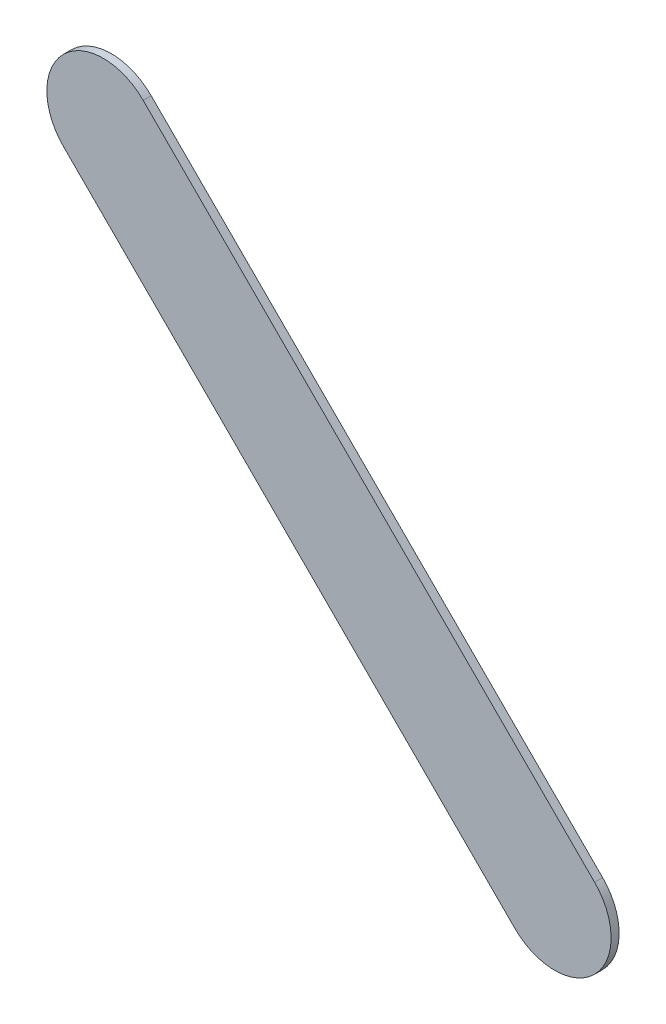
ISO-10303-21;
HEADER;
FILE_DESCRIPTION(('STEP AP214'),'2;1');
FILE_NAME('part.step','',(''),(''),'','','');
FILE_SCHEMA(('AUTOMOTIVE_DESIGN { 1 0 10303 214 1 1 1 1 }'));
ENDSEC;
DATA;
#1=APPLICATION_CONTEXT('core data for automotive mechanical design processes');
#2=APPLICATION_PROTOCOL_DEFINITION('international standard','automotive_design',2000,#1);
#3=PRODUCT_CONTEXT('',#1,'mechanical');
#4=PRODUCT('Part','Part','',(#3));
#5=PRODUCT_RELATED_PRODUCT_CATEGORY('part','',(#4));
#6=PRODUCT_DEFINITION_FORMATION('','',#4);
#7=PRODUCT_DEFINITION_CONTEXT('part definition',#1,'design');
#8=PRODUCT_DEFINITION('design','',#6,#7);
#9=PRODUCT_DEFINITION_SHAPE('','',#8);
#10=(LENGTH_UNIT() NAMED_UNIT(*) SI_UNIT(.MILLI.,.METRE.));
#11=(NAMED_UNIT(*) PLANE_ANGLE_UNIT() SI_UNIT($,.RADIAN.));
#12=(NAMED_UNIT(*) SI_UNIT($,.STERADIAN.) SOLID_ANGLE_UNIT());
#13=UNCERTAINTY_MEASURE_WITH_UNIT(LENGTH_MEASURE(1.E-05),#10,'distance_accuracy_value','');
#14=(GEOMETRIC_REPRESENTATION_CONTEXT(3) GLOBAL_UNCERTAINTY_ASSIGNED_CONTEXT((#13)) GLOBAL_UNIT_ASSIGNED_CONTEXT((#10,
#11,#12)) REPRESENTATION_CONTEXT('',''));
#15=CARTESIAN_POINT('',(0.,0.,0.));
#16=DIRECTION('',(0.,0.,1.));
#17=DIRECTION('',(1.,0.,0.));
#18=AXIS2_PLACEMENT_3D('',#15,#16,#17);
#19=CARTESIAN_POINT('',(35.72322294,83.8232258,0.));
#20=DIRECTION('',(0.707106781186545,0.70710678118655,0.));
#21=DIRECTION('',(0.70710678118655,-0.707106781186545,0.));
#22=AXIS2_PLACEMENT_3D('',#19,#20,#21);
#23=PLANE('',#22);
#24=DIRECTION('',(0.70710678118655,-0.707106781186545,0.));
#25=VECTOR('',#24,1.);
#26=CARTESIAN_POINT('',(35.72322294,83.8232258,0.03556));
#27=LINE('',#26,#25);
#28=CARTESIAN_POINT('',(35.72322294,83.8232258,0.03556));
#29=VERTEX_POINT('',#28);
#30=CARTESIAN_POINT('',(37.72322402,81.82322472,0.03556));
#31=VERTEX_POINT('',#30);
#32=EDGE_CURVE('E11',#29,#31,#27,.T.);
#33=ORIENTED_EDGE('',*,*,#32,.F.);
#34=DIRECTION('',(0.,0.,1.));
#35=VECTOR('',#34,1.);
#36=CARTESIAN_POINT('',(35.72322294,83.8232258,0.));
#37=LINE('',#36,#35);
#38=CARTESIAN_POINT('',(35.72322294,83.8232258,0.));
#39=VERTEX_POINT('',#38);
#40=EDGE_CURVE('E24',#39,#29,#37,.T.);
#41=ORIENTED_EDGE('',*,*,#40,.F.);
#42=DIRECTION('',(0.70710678118655,-0.707106781186545,0.));
#43=VECTOR('',#42,1.);
#44=CARTESIAN_POINT('',(35.72322294,83.8232258,0.));
#45=LINE('',#44,#43);
#46=CARTESIAN_POINT('',(37.72322402,81.82322472,0.));
#47=VERTEX_POINT('',#46);
#48=EDGE_CURVE('E75',#39,#47,#45,.T.);
#49=ORIENTED_EDGE('',*,*,#48,.T.);
#50=DIRECTION('',(0.,0.,1.));
#51=VECTOR('',#50,1.);
#52=CARTESIAN_POINT('',(37.72322402,81.82322472,0.));
#53=LINE('',#52,#51);
#54=EDGE_CURVE('E37',#47,#31,#53,.T.);
#55=ORIENTED_EDGE('',*,*,#54,.T.);
#56=EDGE_LOOP('',(#33,#41,#49,#55));
#57=FACE_BOUND('',#56,.T.);
#58=ADVANCED_FACE('F17',(#57),#23,.F.);
#59=CARTESIAN_POINT('',(37.9000004,82.0000011,0.));
#60=DIRECTION('',(0.,0.,-1.));
#61=DIRECTION('',(-0.707106781186548,-0.707106781186548,0.));
#62=AXIS2_PLACEMENT_3D('',#59,#60,#61);
#63=CYLINDRICAL_SURFACE('',#62,0.249999554103216);
#64=CARTESIAN_POINT('',(37.9000004,82.0000011,0.03556));
#65=DIRECTION('',(0.,0.,1.));
#66=DIRECTION('',(-0.707106781186548,-0.707106781186548,0.));
#67=AXIS2_PLACEMENT_3D('',#64,#65,#66);
#68=CIRCLE('',#67,0.249999554103216);
#69=CARTESIAN_POINT('',(38.07677678,82.17677748,0.03556));
#70=VERTEX_POINT('',#69);
#71=EDGE_CURVE('E83',#31,#70,#68,.T.);
#72=ORIENTED_EDGE('',*,*,#71,.F.);
#73=ORIENTED_EDGE('',*,*,#54,.F.);
#74=CARTESIAN_POINT('',(37.9000004,82.0000011,0.));
#75=DIRECTION('',(0.,0.,1.));
#76=DIRECTION('',(-0.707106781186548,-0.707106781186548,0.));
#77=AXIS2_PLACEMENT_3D('',#74,#75,#76);
#78=CIRCLE('',#77,0.249999554103216);
#79=CARTESIAN_POINT('',(38.07677678,82.17677748,0.));
#80=VERTEX_POINT('',#79);
#81=EDGE_CURVE('E81',#47,#80,#78,.T.);
#82=ORIENTED_EDGE('',*,*,#81,.T.);
#83=DIRECTION('',(0.,0.,1.));
#84=VECTOR('',#83,1.);
#85=CARTESIAN_POINT('',(38.07677678,82.17677748,0.));
#86=LINE('',#85,#84);
#87=EDGE_CURVE('E67',#80,#70,#86,.T.);
#88=ORIENTED_EDGE('',*,*,#87,.T.);
#89=EDGE_LOOP('',(#72,#73,#82,#88));
#90=FACE_BOUND('',#89,.T.);
#91=ADVANCED_FACE('F89',(#90),#63,.T.);
#92=CARTESIAN_POINT('',(38.07677678,82.17677748,0.));
#93=DIRECTION('',(-0.707106781186546,-0.707106781186549,0.));
#94=DIRECTION('',(-0.707106781186549,0.707106781186546,0.));
#95=AXIS2_PLACEMENT_3D('',#92,#93,#94);
#96=PLANE('',#95);
#97=DIRECTION('',(-0.707106781186549,0.707106781186546,0.));
#98=VECTOR('',#97,1.);
#99=CARTESIAN_POINT('',(38.07677678,82.17677748,0.03556));
#100=LINE('',#99,#98);
#101=CARTESIAN_POINT('',(36.0767757,84.17677856,0.03556));
#102=VERTEX_POINT('',#101);
#103=EDGE_CURVE('E71',#70,#102,#100,.T.);
#104=ORIENTED_EDGE('',*,*,#103,.F.);
#105=ORIENTED_EDGE('',*,*,#87,.F.);
#106=DIRECTION('',(-0.707106781186549,0.707106781186546,0.));
#107=VECTOR('',#106,1.);
#108=CARTESIAN_POINT('',(38.07677678,82.17677748,0.));
#109=LINE('',#108,#107);
#110=CARTESIAN_POINT('',(36.0767757,84.17677856,0.));
#111=VERTEX_POINT('',#110);
#112=EDGE_CURVE('E63',#80,#111,#109,.T.);
#113=ORIENTED_EDGE('',*,*,#112,.T.);
#114=DIRECTION('',(0.,0.,1.));
#115=VECTOR('',#114,1.);
#116=CARTESIAN_POINT('',(36.0767757,84.17677856,0.));
#117=LINE('',#116,#115);
#118=EDGE_CURVE('E53',#111,#102,#117,.T.);
#119=ORIENTED_EDGE('',*,*,#118,.T.);
#120=EDGE_LOOP('',(#104,#105,#113,#119));
#121=FACE_BOUND('',#120,.T.);
#122=ADVANCED_FACE('F66',(#121),#96,.F.);
#123=CARTESIAN_POINT('',(35.89999932,84.00000218,0.));
#124=DIRECTION('',(0.,0.,-1.));
#125=DIRECTION('',(0.707106781186562,0.707106781186533,0.));
#126=AXIS2_PLACEMENT_3D('',#123,#124,#125);
#127=CYLINDRICAL_SURFACE('',#126,0.249999554103218);
#128=CARTESIAN_POINT('',(35.89999932,84.00000218,0.03556));
#129=DIRECTION('',(0.,0.,1.));
#130=DIRECTION('',(0.707106781186562,0.707106781186533,0.));
#131=AXIS2_PLACEMENT_3D('',#128,#129,#130);
#132=CIRCLE('',#131,0.249999554103218);
#133=EDGE_CURVE('E59',#102,#29,#132,.T.);
#134=ORIENTED_EDGE('',*,*,#133,.F.);
#135=ORIENTED_EDGE('',*,*,#118,.F.);
#136=CARTESIAN_POINT('',(35.89999932,84.00000218,0.));
#137=DIRECTION('',(0.,0.,1.));
#138=DIRECTION('',(0.707106781186562,0.707106781186533,0.));
#139=AXIS2_PLACEMENT_3D('',#136,#137,#138);
#140=CIRCLE('',#139,0.249999554103218);
#141=EDGE_CURVE('E57',#111,#39,#140,.T.);
#142=ORIENTED_EDGE('',*,*,#141,.T.);
#143=ORIENTED_EDGE('',*,*,#40,.T.);
#144=EDGE_LOOP('',(#134,#135,#142,#143));
#145=FACE_BOUND('',#144,.T.);
#146=ADVANCED_FACE('F55',(#145),#127,.T.);
#147=CARTESIAN_POINT('',(35.72322294,83.8232258,0.));
#148=DIRECTION('',(0.,0.,-1.));
#149=DIRECTION('',(-1.,0.,0.));
#150=AXIS2_PLACEMENT_3D('',#147,#148,#149);
#151=PLANE('',#150);
#152=ORIENTED_EDGE('',*,*,#141,.F.);
#153=ORIENTED_EDGE('',*,*,#112,.F.);
#154=ORIENTED_EDGE('',*,*,#81,.F.);
#155=ORIENTED_EDGE('',*,*,#48,.F.);
#156=EDGE_LOOP('',(#152,#153,#154,#155));
#157=FACE_BOUND('',#156,.T.);
#158=ADVANCED_FACE('F74',(#157),#151,.T.);
#159=CARTESIAN_POINT('',(35.72322294,83.8232258,0.03556));
#160=DIRECTION('',(0.,0.,-1.));
#161=DIRECTION('',(-1.,0.,0.));
#162=AXIS2_PLACEMENT_3D('',#159,#160,#161);
#163=PLANE('',#162);
#164=ORIENTED_EDGE('',*,*,#32,.T.);
#165=ORIENTED_EDGE('',*,*,#71,.T.);
#166=ORIENTED_EDGE('',*,*,#103,.T.);
#167=ORIENTED_EDGE('',*,*,#133,.T.);
#168=EDGE_LOOP('',(#164,#165,#166,#167));
#169=FACE_BOUND('',#168,.T.);
#170=ADVANCED_FACE('F91',(#169),#163,.F.);
#171=CLOSED_SHELL('',(#58,#91,#122,#146,#158,#170));
#172=MANIFOLD_SOLID_BREP('B1',#171);
#173=ADVANCED_BREP_SHAPE_REPRESENTATION('',(#18,#172),#14);
#174=SHAPE_DEFINITION_REPRESENTATION(#9,#173);
ENDSEC;
END-ISO-10303-21;
